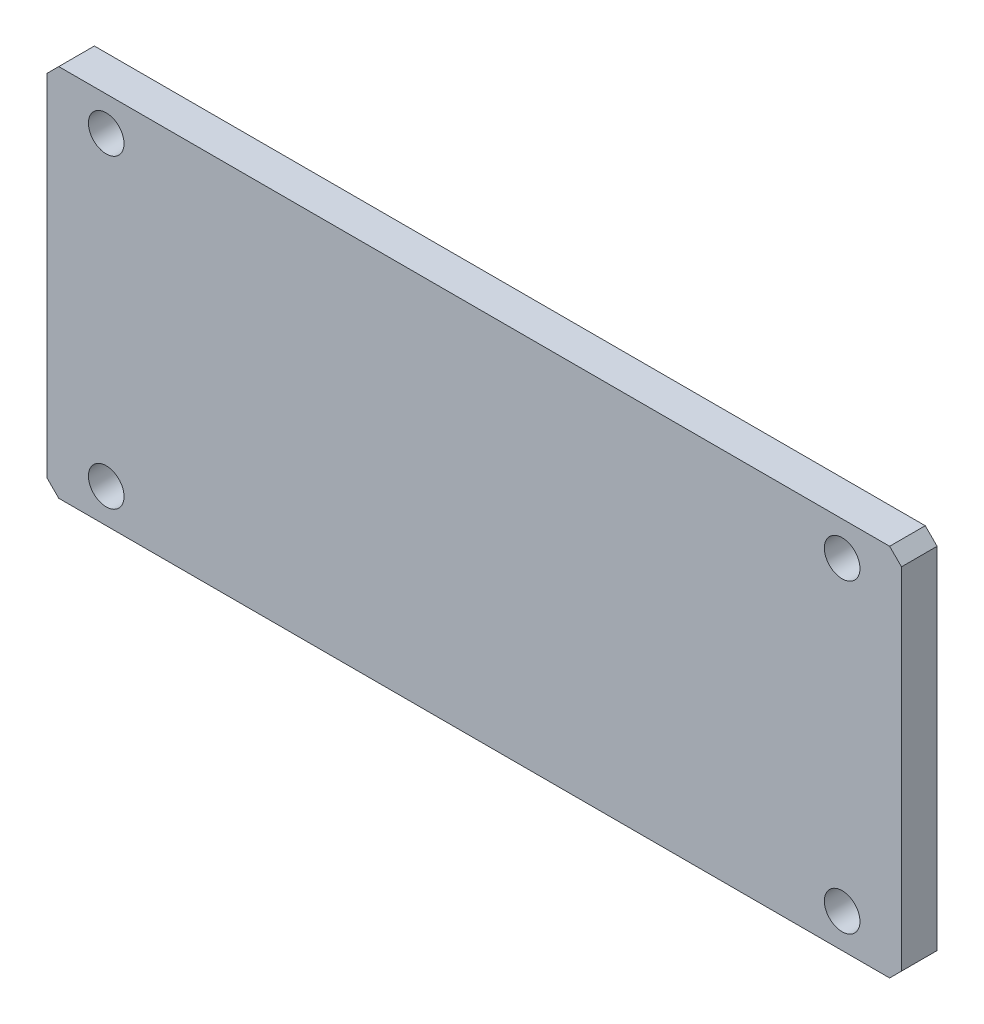
ISO-10303-21;
HEADER;
FILE_DESCRIPTION(('STEP AP214'),'2;1');
FILE_NAME('part.step','',(''),(''),'','','');
FILE_SCHEMA(('AUTOMOTIVE_DESIGN { 1 0 10303 214 1 1 1 1 }'));
ENDSEC;
DATA;
#1=APPLICATION_CONTEXT('core data for automotive mechanical design processes');
#2=APPLICATION_PROTOCOL_DEFINITION('international standard','automotive_design',2000,#1);
#3=PRODUCT_CONTEXT('',#1,'mechanical');
#4=PRODUCT('Part','Part','',(#3));
#5=PRODUCT_RELATED_PRODUCT_CATEGORY('part','',(#4));
#6=PRODUCT_DEFINITION_FORMATION('','',#4);
#7=PRODUCT_DEFINITION_CONTEXT('part definition',#1,'design');
#8=PRODUCT_DEFINITION('design','',#6,#7);
#9=PRODUCT_DEFINITION_SHAPE('','',#8);
#10=(LENGTH_UNIT() NAMED_UNIT(*) SI_UNIT(.MILLI.,.METRE.));
#11=(NAMED_UNIT(*) PLANE_ANGLE_UNIT() SI_UNIT($,.RADIAN.));
#12=(NAMED_UNIT(*) SI_UNIT($,.STERADIAN.) SOLID_ANGLE_UNIT());
#13=UNCERTAINTY_MEASURE_WITH_UNIT(LENGTH_MEASURE(1.E-05),#10,'distance_accuracy_value','');
#14=(GEOMETRIC_REPRESENTATION_CONTEXT(3) GLOBAL_UNCERTAINTY_ASSIGNED_CONTEXT((#13)) GLOBAL_UNIT_ASSIGNED_CONTEXT((#10,
#11,#12)) REPRESENTATION_CONTEXT('',''));
#15=CARTESIAN_POINT('',(0.,0.,0.));
#16=DIRECTION('',(0.,0.,1.));
#17=DIRECTION('',(1.,0.,0.));
#18=AXIS2_PLACEMENT_3D('',#15,#16,#17);
#19=CARTESIAN_POINT('',(2.40323352811029E-12,-1.15700465698317E-09,-176.255225946904));
#20=DIRECTION('',(0.,-6.56419363309623E-12,-1.));
#21=DIRECTION('',(0.,1.,-6.56419363309623E-12));
#22=AXIS2_PLACEMENT_3D('',#19,#20,#21);
#23=PLANE('',#22);
#24=CARTESIAN_POINT('',(-144.897185772561,113.574246413813,-176.255225947652));
#25=DIRECTION('',(0.,-6.5746019739521E-12,-1.));
#26=DIRECTION('',(0.,1.,-6.5746019739521E-12));
#27=AXIS2_PLACEMENT_3D('',#24,#25,#26);
#28=CIRCLE('',#27,1.50000000009306);
#29=CARTESIAN_POINT('',(-144.897185772561,115.074246413906,-176.255225947662));
#30=VERTEX_POINT('',#29);
#31=EDGE_CURVE('E190',#30,#30,#28,.T.);
#32=ORIENTED_EDGE('',*,*,#31,.F.);
#33=EDGE_LOOP('',(#32));
#34=FACE_BOUND('',#33,.T.);
#35=CARTESIAN_POINT('',(-206.897185771738,139.324246415791,-176.255225947821));
#36=DIRECTION('',(0.,-6.5746019739521E-12,-1.));
#37=DIRECTION('',(0.,1.,-6.5746019739521E-12));
#38=AXIS2_PLACEMENT_3D('',#35,#36,#37);
#39=CIRCLE('',#38,1.50000000009667);
#40=CARTESIAN_POINT('',(-206.897185771738,140.824246415888,-176.255225947831));
#41=VERTEX_POINT('',#40);
#42=EDGE_CURVE('E136',#41,#41,#39,.T.);
#43=ORIENTED_EDGE('',*,*,#42,.F.);
#44=EDGE_LOOP('',(#43));
#45=FACE_BOUND('',#44,.T.);
#46=DIRECTION('',(0.707106781186547,0.707106781186547,-4.63177275311713E-12));
#47=VECTOR('',#46,1.);
#48=CARTESIAN_POINT('',(-210.89718577262,142.19924641592,-176.25522594784));
#49=LINE('',#48,#47);
#50=CARTESIAN_POINT('',(-211.89718577262,141.19924641592,-176.255225947834));
#51=VERTEX_POINT('',#50);
#52=CARTESIAN_POINT('',(-210.89718577262,142.19924641592,-176.25522594784));
#53=VERTEX_POINT('',#52);
#54=EDGE_CURVE('E147',#51,#53,#49,.T.);
#55=ORIENTED_EDGE('',*,*,#54,.T.);
#56=DIRECTION('',(1.,0.,0.));
#57=VECTOR('',#56,1.);
#58=CARTESIAN_POINT('',(-140.897185771679,142.19924641592,-176.25522594784));
#59=LINE('',#58,#57);
#60=CARTESIAN_POINT('',(-140.897185771679,142.19924641592,-176.25522594784));
#61=VERTEX_POINT('',#60);
#62=EDGE_CURVE('E95',#53,#61,#59,.T.);
#63=ORIENTED_EDGE('',*,*,#62,.T.);
#64=DIRECTION('',(0.707106781186547,-0.707106781186547,4.63177275311713E-12));
#65=VECTOR('',#64,1.);
#66=CARTESIAN_POINT('',(-139.897185771679,141.19924641592,-176.255225947834));
#67=LINE('',#66,#65);
#68=CARTESIAN_POINT('',(-139.897185771679,141.19924641592,-176.255225947834));
#69=VERTEX_POINT('',#68);
#70=EDGE_CURVE('E162',#61,#69,#67,.T.);
#71=ORIENTED_EDGE('',*,*,#70,.T.);
#72=DIRECTION('',(0.,-1.,6.574778386452E-12));
#73=VECTOR('',#72,1.);
#74=CARTESIAN_POINT('',(-139.897185771679,111.699246415664,-176.25522594764));
#75=LINE('',#74,#73);
#76=CARTESIAN_POINT('',(-139.897185771679,111.699246415664,-176.25522594764));
#77=VERTEX_POINT('',#76);
#78=EDGE_CURVE('E175',#69,#77,#75,.T.);
#79=ORIENTED_EDGE('',*,*,#78,.T.);
#80=DIRECTION('',(-0.707106781186542,-0.707106781186552,4.65139890885065E-12));
#81=VECTOR('',#80,1.);
#82=CARTESIAN_POINT('',(-139.897185771679,111.699246415664,-176.25522594764));
#83=LINE('',#82,#81);
#84=CARTESIAN_POINT('',(-140.897185771679,110.699246415664,-176.255225947633));
#85=VERTEX_POINT('',#84);
#86=EDGE_CURVE('E114',#77,#85,#83,.T.);
#87=ORIENTED_EDGE('',*,*,#86,.T.);
#88=DIRECTION('',(-1.,0.,0.));
#89=VECTOR('',#88,1.);
#90=CARTESIAN_POINT('',(-140.897185771679,110.699246415664,-176.255225947633));
#91=LINE('',#90,#89);
#92=CARTESIAN_POINT('',(-210.89718577262,110.699246415664,-176.255225947633));
#93=VERTEX_POINT('',#92);
#94=EDGE_CURVE('E108',#85,#93,#91,.T.);
#95=ORIENTED_EDGE('',*,*,#94,.T.);
#96=DIRECTION('',(-0.707106781186538,0.707106781186557,-4.65139890885074E-12));
#97=VECTOR('',#96,1.);
#98=CARTESIAN_POINT('',(-210.89718577262,110.699246415664,-176.255225947633));
#99=LINE('',#98,#97);
#100=CARTESIAN_POINT('',(-211.89718577262,111.699246415664,-176.25522594764));
#101=VERTEX_POINT('',#100);
#102=EDGE_CURVE('E112',#93,#101,#99,.T.);
#103=ORIENTED_EDGE('',*,*,#102,.T.);
#104=DIRECTION('',(0.,1.,-6.5747783864519E-12));
#105=VECTOR('',#104,1.);
#106=CARTESIAN_POINT('',(-211.89718577262,111.699246415664,-176.25522594764));
#107=LINE('',#106,#105);
#108=EDGE_CURVE('E52',#101,#51,#107,.T.);
#109=ORIENTED_EDGE('',*,*,#108,.T.);
#110=EDGE_LOOP('',(#55,#63,#71,#79,#87,#95,#103,#109));
#111=FACE_BOUND('',#110,.T.);
#112=CARTESIAN_POINT('',(-206.89718577256,113.574246415792,-176.255225947652));
#113=DIRECTION('',(0.,-6.5746019739521E-12,-1.));
#114=DIRECTION('',(0.,1.,-6.5746019739521E-12));
#115=AXIS2_PLACEMENT_3D('',#112,#113,#114);
#116=CIRCLE('',#115,1.50000000008492);
#117=CARTESIAN_POINT('',(-206.89718577256,115.074246415876,-176.255225947662));
#118=VERTEX_POINT('',#117);
#119=EDGE_CURVE('E184',#118,#118,#116,.T.);
#120=ORIENTED_EDGE('',*,*,#119,.F.);
#121=EDGE_LOOP('',(#120));
#122=FACE_BOUND('',#121,.T.);
#123=CARTESIAN_POINT('',(-144.897185771739,139.324246413813,-176.255225947821));
#124=DIRECTION('',(0.,-6.5746019739521E-12,-1.));
#125=DIRECTION('',(0.,1.,-6.5746019739521E-12));
#126=AXIS2_PLACEMENT_3D('',#123,#124,#125);
#127=CIRCLE('',#126,1.50000000010484);
#128=CARTESIAN_POINT('',(-144.897185771739,140.824246413918,-176.255225947831));
#129=VERTEX_POINT('',#128);
#130=EDGE_CURVE('E196',#129,#129,#127,.T.);
#131=ORIENTED_EDGE('',*,*,#130,.F.);
#132=EDGE_LOOP('',(#131));
#133=FACE_BOUND('',#132,.T.);
#134=ADVANCED_FACE('F35',(#34,#45,#111,#122,#133),#23,.T.);
#135=CARTESIAN_POINT('',(2.40439926228615E-12,-1.13728085106131E-09,-173.255225946904));
#136=DIRECTION('',(0.,-6.56419363309623E-12,-1.));
#137=DIRECTION('',(0.,1.,-6.56419363309623E-12));
#138=AXIS2_PLACEMENT_3D('',#135,#136,#137);
#139=PLANE('',#138);
#140=DIRECTION('',(0.707106781186547,0.707106781186547,-4.63177275311713E-12));
#141=VECTOR('',#140,1.);
#142=CARTESIAN_POINT('',(-210.89718577262,142.19924641594,-173.25522594784));
#143=LINE('',#142,#141);
#144=CARTESIAN_POINT('',(-211.89718577262,141.19924641594,-173.255225947834));
#145=VERTEX_POINT('',#144);
#146=CARTESIAN_POINT('',(-210.89718577262,142.19924641594,-173.25522594784));
#147=VERTEX_POINT('',#146);
#148=EDGE_CURVE('E132',#145,#147,#143,.T.);
#149=ORIENTED_EDGE('',*,*,#148,.F.);
#150=DIRECTION('',(0.,1.,-6.5747783864519E-12));
#151=VECTOR('',#150,1.);
#152=CARTESIAN_POINT('',(-211.89718577262,111.699246415683,-173.25522594764));
#153=LINE('',#152,#151);
#154=CARTESIAN_POINT('',(-211.89718577262,111.699246415683,-173.25522594764));
#155=VERTEX_POINT('',#154);
#156=EDGE_CURVE('E87',#155,#145,#153,.T.);
#157=ORIENTED_EDGE('',*,*,#156,.F.);
#158=DIRECTION('',(-0.707106781186538,0.707106781186557,-4.65139890885074E-12));
#159=VECTOR('',#158,1.);
#160=CARTESIAN_POINT('',(-210.89718577262,110.699246415683,-173.255225947633));
#161=LINE('',#160,#159);
#162=CARTESIAN_POINT('',(-210.89718577262,110.699246415683,-173.255225947633));
#163=VERTEX_POINT('',#162);
#164=EDGE_CURVE('E81',#163,#155,#161,.T.);
#165=ORIENTED_EDGE('',*,*,#164,.F.);
#166=DIRECTION('',(-1.,0.,0.));
#167=VECTOR('',#166,1.);
#168=CARTESIAN_POINT('',(-140.897185771679,110.699246415684,-173.255225947633));
#169=LINE('',#168,#167);
#170=CARTESIAN_POINT('',(-140.897185771679,110.699246415684,-173.255225947633));
#171=VERTEX_POINT('',#170);
#172=EDGE_CURVE('E122',#171,#163,#169,.T.);
#173=ORIENTED_EDGE('',*,*,#172,.F.);
#174=DIRECTION('',(-0.707106781186542,-0.707106781186552,4.65139890885065E-12));
#175=VECTOR('',#174,1.);
#176=CARTESIAN_POINT('',(-139.897185771679,111.699246415684,-173.25522594764));
#177=LINE('',#176,#175);
#178=CARTESIAN_POINT('',(-139.897185771679,111.699246415684,-173.25522594764));
#179=VERTEX_POINT('',#178);
#180=EDGE_CURVE('E142',#179,#171,#177,.T.);
#181=ORIENTED_EDGE('',*,*,#180,.F.);
#182=DIRECTION('',(0.,-1.,6.574778386452E-12));
#183=VECTOR('',#182,1.);
#184=CARTESIAN_POINT('',(-139.897185771679,111.699246415684,-173.25522594764));
#185=LINE('',#184,#183);
#186=CARTESIAN_POINT('',(-139.897185771679,141.19924641594,-173.255225947834));
#187=VERTEX_POINT('',#186);
#188=EDGE_CURVE('E140',#187,#179,#185,.T.);
#189=ORIENTED_EDGE('',*,*,#188,.F.);
#190=DIRECTION('',(0.707106781186547,-0.707106781186547,4.63177275311713E-12));
#191=VECTOR('',#190,1.);
#192=CARTESIAN_POINT('',(-139.897185771679,141.19924641594,-173.255225947834));
#193=LINE('',#192,#191);
#194=CARTESIAN_POINT('',(-140.897185771679,142.19924641594,-173.25522594784));
#195=VERTEX_POINT('',#194);
#196=EDGE_CURVE('E138',#195,#187,#193,.T.);
#197=ORIENTED_EDGE('',*,*,#196,.F.);
#198=DIRECTION('',(1.,0.,0.));
#199=VECTOR('',#198,1.);
#200=CARTESIAN_POINT('',(-140.897185771679,142.19924641594,-173.25522594784));
#201=LINE('',#200,#199);
#202=EDGE_CURVE('E135',#147,#195,#201,.T.);
#203=ORIENTED_EDGE('',*,*,#202,.F.);
#204=EDGE_LOOP('',(#149,#157,#165,#173,#181,#189,#197,#203));
#205=FACE_BOUND('',#204,.T.);
#206=CARTESIAN_POINT('',(-206.897185771738,139.324246415811,-173.255225947821));
#207=DIRECTION('',(0.,-6.5746019739521E-12,-1.));
#208=DIRECTION('',(0.,1.,-6.5746019739521E-12));
#209=AXIS2_PLACEMENT_3D('',#206,#207,#208);
#210=CIRCLE('',#209,1.50000000009667);
#211=CARTESIAN_POINT('',(-206.897185771738,140.824246415908,-173.255225947831));
#212=VERTEX_POINT('',#211);
#213=EDGE_CURVE('E181',#212,#212,#210,.T.);
#214=ORIENTED_EDGE('',*,*,#213,.T.);
#215=EDGE_LOOP('',(#214));
#216=FACE_BOUND('',#215,.T.);
#217=CARTESIAN_POINT('',(-206.89718577256,113.574246415811,-173.255225947652));
#218=DIRECTION('',(0.,-6.5746019739521E-12,-1.));
#219=DIRECTION('',(0.,1.,-6.5746019739521E-12));
#220=AXIS2_PLACEMENT_3D('',#217,#218,#219);
#221=CIRCLE('',#220,1.50000000008492);
#222=CARTESIAN_POINT('',(-206.89718577256,115.074246415896,-173.255225947662));
#223=VERTEX_POINT('',#222);
#224=EDGE_CURVE('E187',#223,#223,#221,.T.);
#225=ORIENTED_EDGE('',*,*,#224,.T.);
#226=EDGE_LOOP('',(#225));
#227=FACE_BOUND('',#226,.T.);
#228=CARTESIAN_POINT('',(-144.897185772561,113.574246413832,-173.255225947652));
#229=DIRECTION('',(0.,-6.5746019739521E-12,-1.));
#230=DIRECTION('',(0.,1.,-6.5746019739521E-12));
#231=AXIS2_PLACEMENT_3D('',#228,#229,#230);
#232=CIRCLE('',#231,1.50000000009306);
#233=CARTESIAN_POINT('',(-144.897185772561,115.074246413926,-173.255225947662));
#234=VERTEX_POINT('',#233);
#235=EDGE_CURVE('E193',#234,#234,#232,.T.);
#236=ORIENTED_EDGE('',*,*,#235,.T.);
#237=EDGE_LOOP('',(#236));
#238=FACE_BOUND('',#237,.T.);
#239=CARTESIAN_POINT('',(-144.897185771739,139.324246413832,-173.255225947821));
#240=DIRECTION('',(0.,-6.5746019739521E-12,-1.));
#241=DIRECTION('',(0.,1.,-6.5746019739521E-12));
#242=AXIS2_PLACEMENT_3D('',#239,#240,#241);
#243=CIRCLE('',#242,1.50000000010484);
#244=CARTESIAN_POINT('',(-144.897185771739,140.824246413937,-173.255225947831));
#245=VERTEX_POINT('',#244);
#246=EDGE_CURVE('E199',#245,#245,#243,.T.);
#247=ORIENTED_EDGE('',*,*,#246,.T.);
#248=EDGE_LOOP('',(#247));
#249=FACE_BOUND('',#248,.T.);
#250=ADVANCED_FACE('F166',(#205,#216,#227,#238,#249),#139,.F.);
#251=CARTESIAN_POINT('',(-210.89718577262,142.19924641592,-176.25522594784));
#252=DIRECTION('',(0.707106781186548,-0.707106781186548,4.64867087320372E-12));
#253=DIRECTION('',(0.707106781186548,0.707106781186548,0.));
#254=AXIS2_PLACEMENT_3D('',#251,#252,#253);
#255=PLANE('',#254);
#256=ORIENTED_EDGE('',*,*,#148,.T.);
#257=DIRECTION('',(0.,6.5746019739521E-12,1.));
#258=VECTOR('',#257,1.);
#259=CARTESIAN_POINT('',(-210.89718577262,142.19924641592,-176.25522594784));
#260=LINE('',#259,#258);
#261=EDGE_CURVE('E11',#53,#147,#260,.T.);
#262=ORIENTED_EDGE('',*,*,#261,.F.);
#263=ORIENTED_EDGE('',*,*,#54,.F.);
#264=DIRECTION('',(0.,6.5746019739521E-12,1.));
#265=VECTOR('',#264,1.);
#266=CARTESIAN_POINT('',(-211.89718577262,141.19924641592,-176.255225947834));
#267=LINE('',#266,#265);
#268=EDGE_CURVE('E128',#51,#145,#267,.T.);
#269=ORIENTED_EDGE('',*,*,#268,.T.);
#270=EDGE_LOOP('',(#256,#262,#263,#269));
#271=FACE_BOUND('',#270,.T.);
#272=ADVANCED_FACE('F37',(#271),#255,.F.);
#273=CARTESIAN_POINT('',(-140.897185771679,142.19924641592,-176.25522594784));
#274=DIRECTION('',(0.,-1.,6.5746019739521E-12));
#275=DIRECTION('',(0.,-6.5746019739521E-12,-1.));
#276=AXIS2_PLACEMENT_3D('',#273,#274,#275);
#277=PLANE('',#276);
#278=ORIENTED_EDGE('',*,*,#202,.T.);
#279=DIRECTION('',(0.,6.5746019739521E-12,1.));
#280=VECTOR('',#279,1.);
#281=CARTESIAN_POINT('',(-140.897185771679,142.19924641592,-176.25522594784));
#282=LINE('',#281,#280);
#283=EDGE_CURVE('E44',#61,#195,#282,.T.);
#284=ORIENTED_EDGE('',*,*,#283,.F.);
#285=ORIENTED_EDGE('',*,*,#62,.F.);
#286=ORIENTED_EDGE('',*,*,#261,.T.);
#287=EDGE_LOOP('',(#278,#284,#285,#286));
#288=FACE_BOUND('',#287,.T.);
#289=ADVANCED_FACE('F233',(#288),#277,.F.);
#290=CARTESIAN_POINT('',(-139.897185771679,141.19924641592,-176.255225947834));
#291=DIRECTION('',(-0.707106781186548,-0.707106781186548,4.64922040556426E-12));
#292=DIRECTION('',(0.707106781186548,-0.707106781186548,0.));
#293=AXIS2_PLACEMENT_3D('',#290,#291,#292);
#294=PLANE('',#293);
#295=ORIENTED_EDGE('',*,*,#196,.T.);
#296=DIRECTION('',(0.,6.5746019739521E-12,1.));
#297=VECTOR('',#296,1.);
#298=CARTESIAN_POINT('',(-139.897185771679,141.19924641592,-176.255225947834));
#299=LINE('',#298,#297);
#300=EDGE_CURVE('E154',#69,#187,#299,.T.);
#301=ORIENTED_EDGE('',*,*,#300,.F.);
#302=ORIENTED_EDGE('',*,*,#70,.F.);
#303=ORIENTED_EDGE('',*,*,#283,.T.);
#304=EDGE_LOOP('',(#295,#301,#302,#303));
#305=FACE_BOUND('',#304,.T.);
#306=ADVANCED_FACE('F160',(#305),#294,.F.);
#307=CARTESIAN_POINT('',(-139.897185771679,111.699246415664,-176.25522594764));
#308=DIRECTION('',(-1.,0.,0.));
#309=DIRECTION('',(0.,0.,1.));
#310=AXIS2_PLACEMENT_3D('',#307,#308,#309);
#311=PLANE('',#310);
#312=ORIENTED_EDGE('',*,*,#188,.T.);
#313=DIRECTION('',(0.,6.5746019739521E-12,1.));
#314=VECTOR('',#313,1.);
#315=CARTESIAN_POINT('',(-139.897185771679,111.699246415664,-176.25522594764));
#316=LINE('',#315,#314);
#317=EDGE_CURVE('E151',#77,#179,#316,.T.);
#318=ORIENTED_EDGE('',*,*,#317,.F.);
#319=ORIENTED_EDGE('',*,*,#78,.F.);
#320=ORIENTED_EDGE('',*,*,#300,.T.);
#321=EDGE_LOOP('',(#312,#318,#319,#320));
#322=FACE_BOUND('',#321,.T.);
#323=ADVANCED_FACE('F171',(#322),#311,.F.);
#324=CARTESIAN_POINT('',(-139.897185771679,111.699246415664,-176.25522594764));
#325=DIRECTION('',(-0.707106781186552,0.707106781186542,-4.64867087320369E-12));
#326=DIRECTION('',(-0.707106781186543,-0.707106781186553,0.));
#327=AXIS2_PLACEMENT_3D('',#324,#325,#326);
#328=PLANE('',#327);
#329=ORIENTED_EDGE('',*,*,#180,.T.);
#330=DIRECTION('',(0.,6.5746019739521E-12,1.));
#331=VECTOR('',#330,1.);
#332=CARTESIAN_POINT('',(-140.897185771679,110.699246415664,-176.255225947633));
#333=LINE('',#332,#331);
#334=EDGE_CURVE('E123',#85,#171,#333,.T.);
#335=ORIENTED_EDGE('',*,*,#334,.F.);
#336=ORIENTED_EDGE('',*,*,#86,.F.);
#337=ORIENTED_EDGE('',*,*,#317,.T.);
#338=EDGE_LOOP('',(#329,#335,#336,#337));
#339=FACE_BOUND('',#338,.T.);
#340=ADVANCED_FACE('F174',(#339),#328,.F.);
#341=CARTESIAN_POINT('',(-140.897185771679,110.699246415664,-176.255225947633));
#342=DIRECTION('',(0.,1.,-6.5746019739521E-12));
#343=DIRECTION('',(0.,6.5746019739521E-12,1.));
#344=AXIS2_PLACEMENT_3D('',#341,#342,#343);
#345=PLANE('',#344);
#346=ORIENTED_EDGE('',*,*,#172,.T.);
#347=DIRECTION('',(0.,6.5746019739521E-12,1.));
#348=VECTOR('',#347,1.);
#349=CARTESIAN_POINT('',(-210.89718577262,110.699246415664,-176.255225947633));
#350=LINE('',#349,#348);
#351=EDGE_CURVE('E119',#93,#163,#350,.T.);
#352=ORIENTED_EDGE('',*,*,#351,.F.);
#353=ORIENTED_EDGE('',*,*,#94,.F.);
#354=ORIENTED_EDGE('',*,*,#334,.T.);
#355=EDGE_LOOP('',(#346,#352,#353,#354));
#356=FACE_BOUND('',#355,.T.);
#357=ADVANCED_FACE('F120',(#356),#345,.F.);
#358=CARTESIAN_POINT('',(-210.89718577262,110.699246415664,-176.255225947633));
#359=DIRECTION('',(0.707106781186557,0.707106781186538,-4.64922040556419E-12));
#360=DIRECTION('',(-0.707106781186538,0.707106781186557,0.));
#361=AXIS2_PLACEMENT_3D('',#358,#359,#360);
#362=PLANE('',#361);
#363=ORIENTED_EDGE('',*,*,#164,.T.);
#364=DIRECTION('',(0.,6.5746019739521E-12,1.));
#365=VECTOR('',#364,1.);
#366=CARTESIAN_POINT('',(-211.89718577262,111.699246415664,-176.25522594764));
#367=LINE('',#366,#365);
#368=EDGE_CURVE('E124',#101,#155,#367,.T.);
#369=ORIENTED_EDGE('',*,*,#368,.F.);
#370=ORIENTED_EDGE('',*,*,#102,.F.);
#371=ORIENTED_EDGE('',*,*,#351,.T.);
#372=EDGE_LOOP('',(#363,#369,#370,#371));
#373=FACE_BOUND('',#372,.T.);
#374=ADVANCED_FACE('F126',(#373),#362,.F.);
#375=CARTESIAN_POINT('',(-211.89718577262,111.699246415664,-176.25522594764));
#376=DIRECTION('',(1.,0.,0.));
#377=DIRECTION('',(0.,1.,0.));
#378=AXIS2_PLACEMENT_3D('',#375,#376,#377);
#379=PLANE('',#378);
#380=ORIENTED_EDGE('',*,*,#156,.T.);
#381=ORIENTED_EDGE('',*,*,#268,.F.);
#382=ORIENTED_EDGE('',*,*,#108,.F.);
#383=ORIENTED_EDGE('',*,*,#368,.T.);
#384=EDGE_LOOP('',(#380,#381,#382,#383));
#385=FACE_BOUND('',#384,.T.);
#386=ADVANCED_FACE('F221',(#385),#379,.F.);
#387=CARTESIAN_POINT('',(-206.897185771738,139.324246415791,-176.255225947821));
#388=DIRECTION('',(0.,6.5746019739521E-12,1.));
#389=DIRECTION('',(0.,-1.,6.5746019739521E-12));
#390=AXIS2_PLACEMENT_3D('',#387,#388,#389);
#391=CYLINDRICAL_SURFACE('',#390,1.50000000009667);
#392=ORIENTED_EDGE('',*,*,#42,.T.);
#393=EDGE_LOOP('',(#392));
#394=FACE_BOUND('',#393,.T.);
#395=ORIENTED_EDGE('',*,*,#213,.F.);
#396=EDGE_LOOP('',(#395));
#397=FACE_BOUND('',#396,.T.);
#398=ADVANCED_FACE('F218',(#394,#397),#391,.F.);
#399=CARTESIAN_POINT('',(-206.89718577256,113.574246415792,-176.255225947652));
#400=DIRECTION('',(0.,6.5746019739521E-12,1.));
#401=DIRECTION('',(0.,-1.,6.5746019739521E-12));
#402=AXIS2_PLACEMENT_3D('',#399,#400,#401);
#403=CYLINDRICAL_SURFACE('',#402,1.50000000008492);
#404=ORIENTED_EDGE('',*,*,#119,.T.);
#405=EDGE_LOOP('',(#404));
#406=FACE_BOUND('',#405,.T.);
#407=ORIENTED_EDGE('',*,*,#224,.F.);
#408=EDGE_LOOP('',(#407));
#409=FACE_BOUND('',#408,.T.);
#410=ADVANCED_FACE('F297',(#406,#409),#403,.F.);
#411=CARTESIAN_POINT('',(-144.897185772561,113.574246413813,-176.255225947652));
#412=DIRECTION('',(0.,6.5746019739521E-12,1.));
#413=DIRECTION('',(0.,-1.,6.5746019739521E-12));
#414=AXIS2_PLACEMENT_3D('',#411,#412,#413);
#415=CYLINDRICAL_SURFACE('',#414,1.50000000009306);
#416=ORIENTED_EDGE('',*,*,#31,.T.);
#417=EDGE_LOOP('',(#416));
#418=FACE_BOUND('',#417,.T.);
#419=ORIENTED_EDGE('',*,*,#235,.F.);
#420=EDGE_LOOP('',(#419));
#421=FACE_BOUND('',#420,.T.);
#422=ADVANCED_FACE('F305',(#418,#421),#415,.F.);
#423=CARTESIAN_POINT('',(-144.897185771739,139.324246413813,-176.255225947821));
#424=DIRECTION('',(0.,6.5746019739521E-12,1.));
#425=DIRECTION('',(0.,-1.,6.5746019739521E-12));
#426=AXIS2_PLACEMENT_3D('',#423,#424,#425);
#427=CYLINDRICAL_SURFACE('',#426,1.50000000010484);
#428=ORIENTED_EDGE('',*,*,#130,.T.);
#429=EDGE_LOOP('',(#428));
#430=FACE_BOUND('',#429,.T.);
#431=ORIENTED_EDGE('',*,*,#246,.F.);
#432=EDGE_LOOP('',(#431));
#433=FACE_BOUND('',#432,.T.);
#434=ADVANCED_FACE('F205',(#430,#433),#427,.F.);
#435=CLOSED_SHELL('',(#134,#250,#272,#289,#306,#323,#340,#357,#374,#386,#398,#410,#422,#434));
#436=MANIFOLD_SOLID_BREP('B2',#435);
#437=ADVANCED_BREP_SHAPE_REPRESENTATION('',(#18,#436),#14);
#438=SHAPE_DEFINITION_REPRESENTATION(#9,#437);
ENDSEC;
END-ISO-10303-21;
